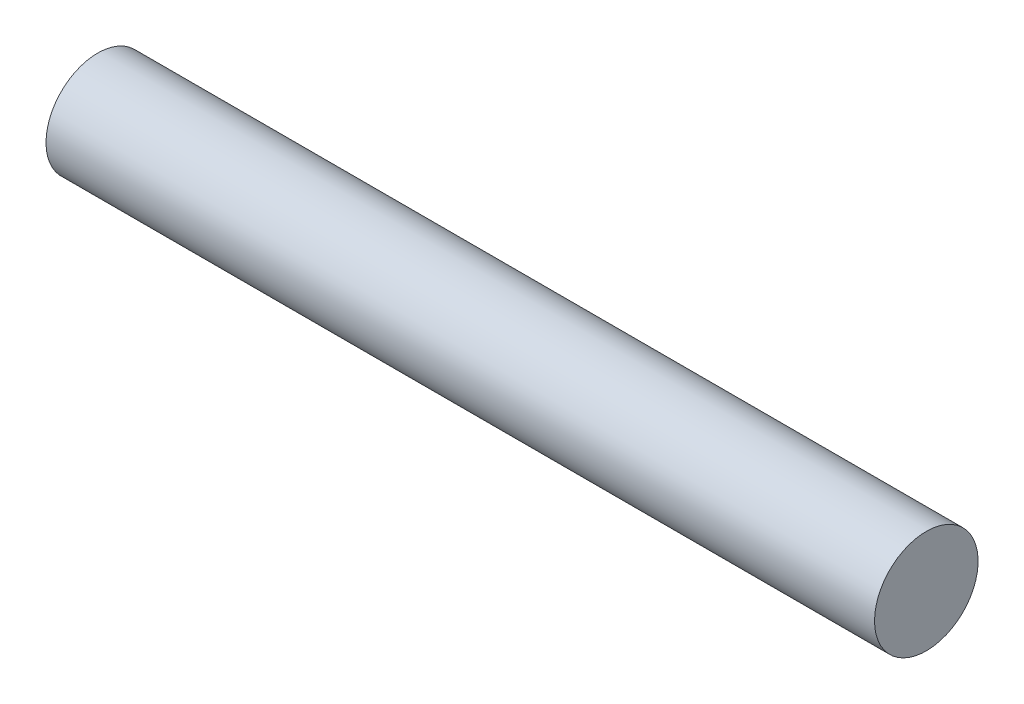
ISO-10303-21;
HEADER;
FILE_DESCRIPTION(('STEP AP214'),'2;1');
FILE_NAME('part.step','',(''),(''),'','','');
FILE_SCHEMA(('AUTOMOTIVE_DESIGN { 1 0 10303 214 1 1 1 1 }'));
ENDSEC;
DATA;
#1=APPLICATION_CONTEXT('core data for automotive mechanical design processes');
#2=APPLICATION_PROTOCOL_DEFINITION('international standard','automotive_design',2000,#1);
#3=PRODUCT_CONTEXT('',#1,'mechanical');
#4=PRODUCT('Part','Part','',(#3));
#5=PRODUCT_RELATED_PRODUCT_CATEGORY('part','',(#4));
#6=PRODUCT_DEFINITION_FORMATION('','',#4);
#7=PRODUCT_DEFINITION_CONTEXT('part definition',#1,'design');
#8=PRODUCT_DEFINITION('design','',#6,#7);
#9=PRODUCT_DEFINITION_SHAPE('','',#8);
#10=(LENGTH_UNIT() NAMED_UNIT(*) SI_UNIT(.MILLI.,.METRE.));
#11=(NAMED_UNIT(*) PLANE_ANGLE_UNIT() SI_UNIT($,.RADIAN.));
#12=(NAMED_UNIT(*) SI_UNIT($,.STERADIAN.) SOLID_ANGLE_UNIT());
#13=UNCERTAINTY_MEASURE_WITH_UNIT(LENGTH_MEASURE(1.E-05),#10,'distance_accuracy_value','');
#14=(GEOMETRIC_REPRESENTATION_CONTEXT(3) GLOBAL_UNCERTAINTY_ASSIGNED_CONTEXT((#13)) GLOBAL_UNIT_ASSIGNED_CONTEXT((#10,
#11,#12)) REPRESENTATION_CONTEXT('',''));
#15=CARTESIAN_POINT('',(0.,0.,0.));
#16=DIRECTION('',(0.,0.,1.));
#17=DIRECTION('',(1.,0.,0.));
#18=AXIS2_PLACEMENT_3D('',#15,#16,#17);
#19=CARTESIAN_POINT('',(19.05,0.,0.));
#20=DIRECTION('',(-1.,0.,0.));
#21=DIRECTION('',(0.,0.,1.));
#22=AXIS2_PLACEMENT_3D('',#19,#20,#21);
#23=CYLINDRICAL_SURFACE('',#22,2.38125);
#24=CARTESIAN_POINT('',(19.05,0.,0.));
#25=DIRECTION('',(1.,0.,0.));
#26=DIRECTION('',(0.,0.,-1.));
#27=AXIS2_PLACEMENT_3D('',#24,#25,#26);
#28=CIRCLE('',#27,2.38125);
#29=CARTESIAN_POINT('',(19.05,0.,2.38125));
#30=VERTEX_POINT('',#29);
#31=EDGE_CURVE('E10',#30,#30,#28,.T.);
#32=CARTESIAN_POINT('',(-19.05,0.,0.));
#33=DIRECTION('',(1.,0.,0.));
#34=DIRECTION('',(0.,0.,-1.));
#35=AXIS2_PLACEMENT_3D('',#32,#33,#34);
#36=CIRCLE('',#35,2.38125);
#37=CARTESIAN_POINT('',(-19.05,0.,2.38125));
#38=VERTEX_POINT('',#37);
#39=EDGE_CURVE('E42',#38,#38,#36,.T.);
#40=CARTESIAN_POINT('',(19.05,0.,2.38125));
#41=CARTESIAN_POINT('',(18.653125,0.,2.38125));
#42=CARTESIAN_POINT('',(18.25625,0.,2.38125));
#43=CARTESIAN_POINT('',(17.4625,0.,2.38125));
#44=CARTESIAN_POINT('',(17.065625,0.,2.38125));
#45=CARTESIAN_POINT('',(16.271875,0.,2.38125));
#46=CARTESIAN_POINT('',(15.875,0.,2.38125));
#47=CARTESIAN_POINT('',(15.08125,0.,2.38125));
#48=CARTESIAN_POINT('',(14.684375,0.,2.38125));
#49=CARTESIAN_POINT('',(13.890625,0.,2.38125));
#50=CARTESIAN_POINT('',(13.49375,0.,2.38125));
#51=CARTESIAN_POINT('',(12.7,0.,2.38125));
#52=CARTESIAN_POINT('',(12.303125,0.,2.38125));
#53=CARTESIAN_POINT('',(11.509375,0.,2.38125));
#54=CARTESIAN_POINT('',(11.1125,0.,2.38125));
#55=CARTESIAN_POINT('',(10.31875,0.,2.38125));
#56=CARTESIAN_POINT('',(9.921875,0.,2.38125));
#57=CARTESIAN_POINT('',(9.128125,0.,2.38125));
#58=CARTESIAN_POINT('',(8.73125,0.,2.38125));
#59=CARTESIAN_POINT('',(7.9375,0.,2.38125));
#60=CARTESIAN_POINT('',(7.540625,0.,2.38125));
#61=CARTESIAN_POINT('',(6.746875,0.,2.38125));
#62=CARTESIAN_POINT('',(6.35,0.,2.38125));
#63=CARTESIAN_POINT('',(5.55625,0.,2.38125));
#64=CARTESIAN_POINT('',(5.159375,0.,2.38125));
#65=CARTESIAN_POINT('',(4.365625,0.,2.38125));
#66=CARTESIAN_POINT('',(3.96875,0.,2.38125));
#67=CARTESIAN_POINT('',(3.175,0.,2.38125));
#68=CARTESIAN_POINT('',(2.778125,0.,2.38125));
#69=CARTESIAN_POINT('',(1.984375,0.,2.38125));
#70=CARTESIAN_POINT('',(1.5875,0.,2.38125));
#71=CARTESIAN_POINT('',(0.79375,0.,2.38125));
#72=CARTESIAN_POINT('',(0.396875,0.,2.38125));
#73=CARTESIAN_POINT('',(-0.396875,0.,2.38125));
#74=CARTESIAN_POINT('',(-0.79375,0.,2.38125));
#75=CARTESIAN_POINT('',(-1.5875,0.,2.38125));
#76=CARTESIAN_POINT('',(-1.984375,0.,2.38125));
#77=CARTESIAN_POINT('',(-2.778125,0.,2.38125));
#78=CARTESIAN_POINT('',(-3.175,0.,2.38125));
#79=CARTESIAN_POINT('',(-3.96875,0.,2.38125));
#80=CARTESIAN_POINT('',(-4.365625,0.,2.38125));
#81=CARTESIAN_POINT('',(-5.159375,0.,2.38125));
#82=CARTESIAN_POINT('',(-5.55625,0.,2.38125));
#83=CARTESIAN_POINT('',(-6.35,0.,2.38125));
#84=CARTESIAN_POINT('',(-6.746875,0.,2.38125));
#85=CARTESIAN_POINT('',(-7.540625,0.,2.38125));
#86=CARTESIAN_POINT('',(-7.9375,0.,2.38125));
#87=CARTESIAN_POINT('',(-8.73125,0.,2.38125));
#88=CARTESIAN_POINT('',(-9.128125,0.,2.38125));
#89=CARTESIAN_POINT('',(-9.921875,0.,2.38125));
#90=CARTESIAN_POINT('',(-10.31875,0.,2.38125));
#91=CARTESIAN_POINT('',(-11.1125,0.,2.38125));
#92=CARTESIAN_POINT('',(-11.509375,0.,2.38125));
#93=CARTESIAN_POINT('',(-12.303125,0.,2.38125));
#94=CARTESIAN_POINT('',(-12.7,0.,2.38125));
#95=CARTESIAN_POINT('',(-13.49375,0.,2.38125));
#96=CARTESIAN_POINT('',(-13.890625,0.,2.38125));
#97=CARTESIAN_POINT('',(-14.684375,0.,2.38125));
#98=CARTESIAN_POINT('',(-15.08125,0.,2.38125));
#99=CARTESIAN_POINT('',(-15.875,0.,2.38125));
#100=CARTESIAN_POINT('',(-16.271875,0.,2.38125));
#101=CARTESIAN_POINT('',(-17.065625,0.,2.38125));
#102=CARTESIAN_POINT('',(-17.4625,0.,2.38125));
#103=CARTESIAN_POINT('',(-18.25625,0.,2.38125));
#104=CARTESIAN_POINT('',(-18.653125,0.,2.38125));
#105=CARTESIAN_POINT('',(-19.05,0.,2.38125));
#106=B_SPLINE_CURVE_WITH_KNOTS('',3,(#40,#41,#42,#43,#44,#45,#46,#47,#48,#49,#50,#51,#52,#53,
#54,#55,#56,#57,#58,#59,#60,#61,#62,#63,#64,#65,#66,#67,#68,#69,#70,#71,#72,#73,#74,#75,#76,#77,
#78,#79,#80,#81,#82,#83,#84,#85,#86,#87,#88,#89,#90,#91,#92,#93,#94,#95,#96,#97,#98,#99,#100,
#101,#102,#103,#104,#105),.UNSPECIFIED.,.F.,.F.,(4,2,2,2,2,2,2,2,2,2,2,2,2,2,2,2,2,2,2,2,2,2,2,
2,2,2,2,2,2,2,2,2,4),(0.,1.190625,2.38125,3.571875,4.7625,5.953125,7.14375,8.334375,9.525,
10.715625,11.90625,13.096875,14.2875,15.478125,16.66875,17.859375,19.05,20.240625,21.43125,
22.621875,23.8125,25.003125,26.19375,27.384375,28.575,29.765625,30.95625,32.146875,33.3375,
34.528125,35.71875,36.909375,38.1),.UNSPECIFIED.);
#107=EDGE_CURVE('BSEAM39',#30,#38,#106,.T.);
#108=ORIENTED_EDGE('',*,*,#31,.F.);
#109=ORIENTED_EDGE('',*,*,#39,.T.);
#110=ORIENTED_EDGE('',*,*,#107,.T.);
#111=ORIENTED_EDGE('',*,*,#107,.F.);
#112=EDGE_LOOP('',(#108,#110,#109,#111));
#113=FACE_BOUND('',#112,.T.);
#114=ADVANCED_FACE('F39',(#113),#23,.T.);
#115=CARTESIAN_POINT('',(19.05,0.,0.));
#116=DIRECTION('',(1.,0.,0.));
#117=DIRECTION('',(0.,0.,-1.));
#118=AXIS2_PLACEMENT_3D('',#115,#116,#117);
#119=PLANE('',#118);
#120=ORIENTED_EDGE('',*,*,#31,.T.);
#121=EDGE_LOOP('',(#120));
#122=FACE_BOUND('',#121,.T.);
#123=ADVANCED_FACE('F54',(#122),#119,.T.);
#124=CARTESIAN_POINT('',(-19.05,0.,0.));
#125=DIRECTION('',(1.,0.,0.));
#126=DIRECTION('',(0.,0.,-1.));
#127=AXIS2_PLACEMENT_3D('',#124,#125,#126);
#128=PLANE('',#127);
#129=ORIENTED_EDGE('',*,*,#39,.F.);
#130=EDGE_LOOP('',(#129));
#131=FACE_BOUND('',#130,.T.);
#132=ADVANCED_FACE('F52',(#131),#128,.F.);
#133=CLOSED_SHELL('',(#114,#123,#132));
#134=MANIFOLD_SOLID_BREP('B2',#133);
#135=ADVANCED_BREP_SHAPE_REPRESENTATION('',(#18,#134),#14);
#136=SHAPE_DEFINITION_REPRESENTATION(#9,#135);
ENDSEC;
END-ISO-10303-21;
